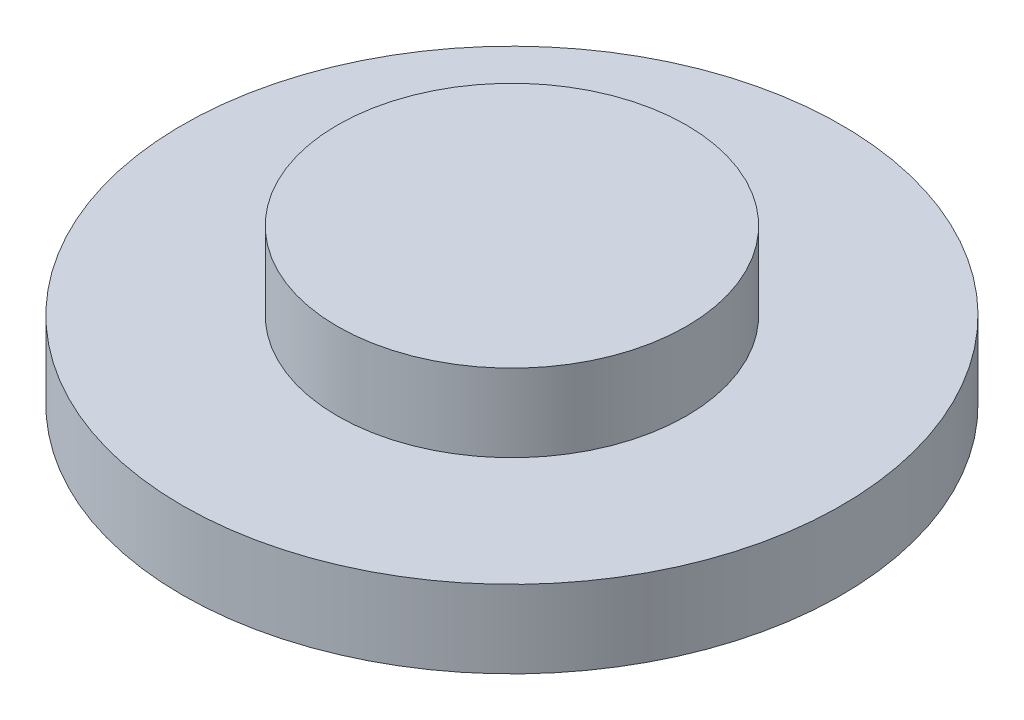
ISO-10303-21;
HEADER;
FILE_DESCRIPTION(('STEP AP214'),'2;1');
FILE_NAME('part.step','',(''),(''),'','','');
FILE_SCHEMA(('AUTOMOTIVE_DESIGN { 1 0 10303 214 1 1 1 1 }'));
ENDSEC;
DATA;
#1=APPLICATION_CONTEXT('core data for automotive mechanical design processes');
#2=APPLICATION_PROTOCOL_DEFINITION('international standard','automotive_design',2000,#1);
#3=PRODUCT_CONTEXT('',#1,'mechanical');
#4=PRODUCT('Part','Part','',(#3));
#5=PRODUCT_RELATED_PRODUCT_CATEGORY('part','',(#4));
#6=PRODUCT_DEFINITION_FORMATION('','',#4);
#7=PRODUCT_DEFINITION_CONTEXT('part definition',#1,'design');
#8=PRODUCT_DEFINITION('design','',#6,#7);
#9=PRODUCT_DEFINITION_SHAPE('','',#8);
#10=(LENGTH_UNIT() NAMED_UNIT(*) SI_UNIT(.MILLI.,.METRE.));
#11=(NAMED_UNIT(*) PLANE_ANGLE_UNIT() SI_UNIT($,.RADIAN.));
#12=(NAMED_UNIT(*) SI_UNIT($,.STERADIAN.) SOLID_ANGLE_UNIT());
#13=UNCERTAINTY_MEASURE_WITH_UNIT(LENGTH_MEASURE(1.E-05),#10,'distance_accuracy_value','');
#14=(GEOMETRIC_REPRESENTATION_CONTEXT(3) GLOBAL_UNCERTAINTY_ASSIGNED_CONTEXT((#13)) GLOBAL_UNIT_ASSIGNED_CONTEXT((#10,
#11,#12)) REPRESENTATION_CONTEXT('',''));
#15=CARTESIAN_POINT('',(0.,0.,0.));
#16=DIRECTION('',(0.,0.,1.));
#17=DIRECTION('',(1.,0.,0.));
#18=AXIS2_PLACEMENT_3D('',#15,#16,#17);
#19=CARTESIAN_POINT('',(0.,2.,0.));
#20=DIRECTION('',(0.,-1.,0.));
#21=DIRECTION('',(0.,0.,-1.));
#22=AXIS2_PLACEMENT_3D('',#19,#20,#21);
#23=CYLINDRICAL_SURFACE('',#22,8.5);
#24=CARTESIAN_POINT('',(0.,2.,0.));
#25=DIRECTION('',(0.,1.,0.));
#26=DIRECTION('',(0.,0.,1.));
#27=AXIS2_PLACEMENT_3D('',#24,#25,#26);
#28=CIRCLE('',#27,8.5);
#29=CARTESIAN_POINT('',(0.,2.,8.5));
#30=VERTEX_POINT('',#29);
#31=EDGE_CURVE('E38',#30,#30,#28,.T.);
#32=ORIENTED_EDGE('',*,*,#31,.F.);
#33=EDGE_LOOP('',(#32));
#34=FACE_BOUND('',#33,.T.);
#35=CARTESIAN_POINT('',(0.,0.,0.));
#36=DIRECTION('',(0.,1.,0.));
#37=DIRECTION('',(0.,0.,1.));
#38=AXIS2_PLACEMENT_3D('',#35,#36,#37);
#39=CIRCLE('',#38,8.5);
#40=CARTESIAN_POINT('',(0.,0.,8.5));
#41=VERTEX_POINT('',#40);
#42=EDGE_CURVE('E34',#41,#41,#39,.T.);
#43=ORIENTED_EDGE('',*,*,#42,.T.);
#44=EDGE_LOOP('',(#43));
#45=FACE_BOUND('',#44,.T.);
#46=ADVANCED_FACE('F31',(#34,#45),#23,.T.);
#47=CARTESIAN_POINT('',(0.,2.,0.));
#48=DIRECTION('',(0.,1.,0.));
#49=DIRECTION('',(0.,0.,1.));
#50=AXIS2_PLACEMENT_3D('',#47,#48,#49);
#51=PLANE('',#50);
#52=CARTESIAN_POINT('',(0.,2.,0.));
#53=DIRECTION('',(0.,1.,0.));
#54=DIRECTION('',(0.,0.,1.));
#55=AXIS2_PLACEMENT_3D('',#52,#53,#54);
#56=CIRCLE('',#55,4.5);
#57=CARTESIAN_POINT('',(0.,2.,4.5));
#58=VERTEX_POINT('',#57);
#59=EDGE_CURVE('E10',#58,#58,#56,.T.);
#60=ORIENTED_EDGE('',*,*,#59,.F.);
#61=EDGE_LOOP('',(#60));
#62=FACE_BOUND('',#61,.T.);
#63=ORIENTED_EDGE('',*,*,#31,.T.);
#64=EDGE_LOOP('',(#63));
#65=FACE_BOUND('',#64,.T.);
#66=ADVANCED_FACE('F67',(#62,#65),#51,.T.);
#67=CARTESIAN_POINT('',(0.,0.,0.));
#68=DIRECTION('',(0.,1.,0.));
#69=DIRECTION('',(0.,0.,1.));
#70=AXIS2_PLACEMENT_3D('',#67,#68,#69);
#71=PLANE('',#70);
#72=CARTESIAN_POINT('',(0.,0.,0.));
#73=DIRECTION('',(0.,-1.,0.));
#74=DIRECTION('',(0.,0.,-1.));
#75=AXIS2_PLACEMENT_3D('',#72,#73,#74);
#76=CIRCLE('',#75,4.75);
#77=CARTESIAN_POINT('',(0.,0.,-4.75));
#78=VERTEX_POINT('',#77);
#79=EDGE_CURVE('E48',#78,#78,#76,.T.);
#80=ORIENTED_EDGE('',*,*,#79,.F.);
#81=EDGE_LOOP('',(#80));
#82=FACE_BOUND('',#81,.T.);
#83=ORIENTED_EDGE('',*,*,#42,.F.);
#84=EDGE_LOOP('',(#83));
#85=FACE_BOUND('',#84,.T.);
#86=ADVANCED_FACE('F63',(#82,#85),#71,.F.);
#87=CARTESIAN_POINT('',(0.,4.,0.));
#88=DIRECTION('',(0.,-1.,0.));
#89=DIRECTION('',(0.,0.,-1.));
#90=AXIS2_PLACEMENT_3D('',#87,#88,#89);
#91=CYLINDRICAL_SURFACE('',#90,4.5);
#92=CARTESIAN_POINT('',(0.,4.,0.));
#93=DIRECTION('',(0.,1.,0.));
#94=DIRECTION('',(0.,0.,1.));
#95=AXIS2_PLACEMENT_3D('',#92,#93,#94);
#96=CIRCLE('',#95,4.5);
#97=CARTESIAN_POINT('',(0.,4.,4.5));
#98=VERTEX_POINT('',#97);
#99=EDGE_CURVE('E44',#98,#98,#96,.T.);
#100=ORIENTED_EDGE('',*,*,#99,.F.);
#101=EDGE_LOOP('',(#100));
#102=FACE_BOUND('',#101,.T.);
#103=ORIENTED_EDGE('',*,*,#59,.T.);
#104=EDGE_LOOP('',(#103));
#105=FACE_BOUND('',#104,.T.);
#106=ADVANCED_FACE('F66',(#102,#105),#91,.T.);
#107=CARTESIAN_POINT('',(0.,4.,0.));
#108=DIRECTION('',(0.,1.,0.));
#109=DIRECTION('',(0.,0.,1.));
#110=AXIS2_PLACEMENT_3D('',#107,#108,#109);
#111=PLANE('',#110);
#112=ORIENTED_EDGE('',*,*,#99,.T.);
#113=EDGE_LOOP('',(#112));
#114=FACE_BOUND('',#113,.T.);
#115=ADVANCED_FACE('F59',(#114),#111,.T.);
#116=CARTESIAN_POINT('',(0.,0.999999999999998,0.));
#117=DIRECTION('',(0.,-1.,0.));
#118=DIRECTION('',(0.,0.,-1.));
#119=AXIS2_PLACEMENT_3D('',#116,#117,#118);
#120=CYLINDRICAL_SURFACE('',#119,4.75);
#121=CARTESIAN_POINT('',(0.,0.999999999999998,0.));
#122=DIRECTION('',(0.,-1.,0.));
#123=DIRECTION('',(0.,0.,-1.));
#124=AXIS2_PLACEMENT_3D('',#121,#122,#123);
#125=CIRCLE('',#124,4.75);
#126=CARTESIAN_POINT('',(0.,0.999999999999998,-4.75));
#127=VERTEX_POINT('',#126);
#128=EDGE_CURVE('E47',#127,#127,#125,.T.);
#129=ORIENTED_EDGE('',*,*,#128,.F.);
#130=EDGE_LOOP('',(#129));
#131=FACE_BOUND('',#130,.T.);
#132=ORIENTED_EDGE('',*,*,#79,.T.);
#133=EDGE_LOOP('',(#132));
#134=FACE_BOUND('',#133,.T.);
#135=ADVANCED_FACE('F56',(#131,#134),#120,.F.);
#136=CARTESIAN_POINT('',(0.,0.999999999999998,0.));
#137=DIRECTION('',(0.,-1.,0.));
#138=DIRECTION('',(0.,0.,-1.));
#139=AXIS2_PLACEMENT_3D('',#136,#137,#138);
#140=PLANE('',#139);
#141=ORIENTED_EDGE('',*,*,#128,.T.);
#142=EDGE_LOOP('',(#141));
#143=FACE_BOUND('',#142,.T.);
#144=ADVANCED_FACE('F54',(#143),#140,.T.);
#145=CLOSED_SHELL('',(#46,#66,#86,#106,#115,#135,#144));
#146=MANIFOLD_SOLID_BREP('B2',#145);
#147=ADVANCED_BREP_SHAPE_REPRESENTATION('',(#18,#146),#14);
#148=SHAPE_DEFINITION_REPRESENTATION(#9,#147);
ENDSEC;
END-ISO-10303-21;
